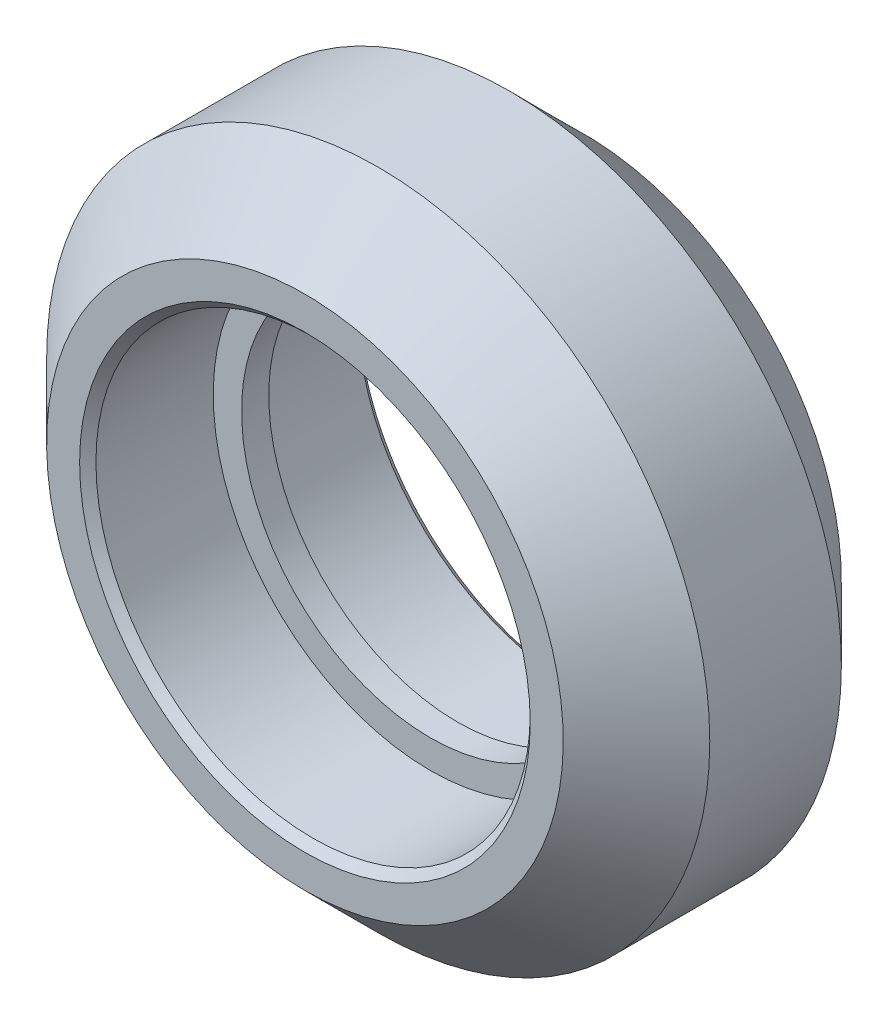
ISO-10303-21;
HEADER;
FILE_DESCRIPTION(('STEP AP214'),'2;1');
FILE_NAME('part.step','',(''),(''),'','','');
FILE_SCHEMA(('AUTOMOTIVE_DESIGN { 1 0 10303 214 1 1 1 1 }'));
ENDSEC;
DATA;
#1=APPLICATION_CONTEXT('core data for automotive mechanical design processes');
#2=APPLICATION_PROTOCOL_DEFINITION('international standard','automotive_design',2000,#1);
#3=PRODUCT_CONTEXT('',#1,'mechanical');
#4=PRODUCT('Part','Part','',(#3));
#5=PRODUCT_RELATED_PRODUCT_CATEGORY('part','',(#4));
#6=PRODUCT_DEFINITION_FORMATION('','',#4);
#7=PRODUCT_DEFINITION_CONTEXT('part definition',#1,'design');
#8=PRODUCT_DEFINITION('design','',#6,#7);
#9=PRODUCT_DEFINITION_SHAPE('','',#8);
#10=(LENGTH_UNIT() NAMED_UNIT(*) SI_UNIT(.MILLI.,.METRE.));
#11=(NAMED_UNIT(*) PLANE_ANGLE_UNIT() SI_UNIT($,.RADIAN.));
#12=(NAMED_UNIT(*) SI_UNIT($,.STERADIAN.) SOLID_ANGLE_UNIT());
#13=UNCERTAINTY_MEASURE_WITH_UNIT(LENGTH_MEASURE(1.E-05),#10,'distance_accuracy_value','');
#14=(GEOMETRIC_REPRESENTATION_CONTEXT(3) GLOBAL_UNCERTAINTY_ASSIGNED_CONTEXT((#13)) GLOBAL_UNIT_ASSIGNED_CONTEXT((#10,
#11,#12)) REPRESENTATION_CONTEXT('',''));
#15=CARTESIAN_POINT('',(0.,0.,0.));
#16=DIRECTION('',(0.,0.,1.));
#17=DIRECTION('',(1.,0.,0.));
#18=AXIS2_PLACEMENT_3D('',#15,#16,#17);
#19=CARTESIAN_POINT('',(0.,0.,5.115));
#20=DIRECTION('',(0.,0.,1.));
#21=DIRECTION('',(0.,-1.,0.));
#22=AXIS2_PLACEMENT_3D('',#19,#20,#21);
#23=CYLINDRICAL_SURFACE('',#22,7.987);
#24=CARTESIAN_POINT('',(0.,0.,4.815));
#25=DIRECTION('',(0.,0.,-1.));
#26=DIRECTION('',(0.,1.,0.));
#27=AXIS2_PLACEMENT_3D('',#24,#25,#26);
#28=CIRCLE('',#27,7.987);
#29=CARTESIAN_POINT('',(0.,7.987,4.815));
#30=VERTEX_POINT('',#29);
#31=EDGE_CURVE('E45',#30,#30,#28,.F.);
#32=ORIENTED_EDGE('',*,*,#31,.T.);
#33=EDGE_LOOP('',(#32));
#34=FACE_BOUND('',#33,.T.);
#35=CARTESIAN_POINT('',(0.,0.,0.499999999999998));
#36=DIRECTION('',(0.,0.,1.));
#37=DIRECTION('',(0.,-1.,0.));
#38=AXIS2_PLACEMENT_3D('',#35,#36,#37);
#39=CIRCLE('',#38,7.987);
#40=CARTESIAN_POINT('',(0.,-7.987,0.499999999999996));
#41=VERTEX_POINT('',#40);
#42=EDGE_CURVE('E71',#41,#41,#39,.T.);
#43=ORIENTED_EDGE('',*,*,#42,.F.);
#44=EDGE_LOOP('',(#43));
#45=FACE_BOUND('',#44,.T.);
#46=ADVANCED_FACE('F30',(#34,#45),#23,.F.);
#47=CARTESIAN_POINT('',(0.,9.5,5.115));
#48=DIRECTION('',(0.,0.,-1.));
#49=DIRECTION('',(0.,1.,0.));
#50=AXIS2_PLACEMENT_3D('',#47,#48,#49);
#51=PLANE('',#50);
#52=CARTESIAN_POINT('',(0.,0.,5.115));
#53=DIRECTION('',(0.,0.,-1.));
#54=DIRECTION('',(0.,1.,0.));
#55=AXIS2_PLACEMENT_3D('',#52,#53,#54);
#56=CIRCLE('',#55,8.287);
#57=CARTESIAN_POINT('',(0.,8.287,5.115));
#58=VERTEX_POINT('',#57);
#59=EDGE_CURVE('E41',#58,#58,#56,.T.);
#60=ORIENTED_EDGE('',*,*,#59,.T.);
#61=EDGE_LOOP('',(#60));
#62=FACE_BOUND('',#61,.T.);
#63=CARTESIAN_POINT('',(0.,0.,5.115));
#64=DIRECTION('',(0.,0.,1.));
#65=DIRECTION('',(0.,-1.,0.));
#66=AXIS2_PLACEMENT_3D('',#63,#64,#65);
#67=CIRCLE('',#66,9.5);
#68=CARTESIAN_POINT('',(0.,-9.5,5.11499999999999));
#69=VERTEX_POINT('',#68);
#70=EDGE_CURVE('E50',#69,#69,#67,.T.);
#71=ORIENTED_EDGE('',*,*,#70,.T.);
#72=EDGE_LOOP('',(#71));
#73=FACE_BOUND('',#72,.T.);
#74=ADVANCED_FACE('F78',(#62,#73),#51,.F.);
#75=CARTESIAN_POINT('',(0.,0.,2.42));
#76=DIRECTION('',(0.,0.,-1.));
#77=DIRECTION('',(0.,1.,0.));
#78=AXIS2_PLACEMENT_3D('',#75,#76,#77);
#79=CONICAL_SURFACE('',#78,12.195,0.78539816339745);
#80=ORIENTED_EDGE('',*,*,#70,.F.);
#81=EDGE_LOOP('',(#80));
#82=FACE_BOUND('',#81,.T.);
#83=CARTESIAN_POINT('',(0.,0.,2.42));
#84=DIRECTION('',(0.,0.,1.));
#85=DIRECTION('',(0.,-1.,0.));
#86=AXIS2_PLACEMENT_3D('',#83,#84,#85);
#87=CIRCLE('',#86,12.195);
#88=CARTESIAN_POINT('',(0.,-12.195,2.42));
#89=VERTEX_POINT('',#88);
#90=EDGE_CURVE('E53',#89,#89,#87,.T.);
#91=ORIENTED_EDGE('',*,*,#90,.T.);
#92=EDGE_LOOP('',(#91));
#93=FACE_BOUND('',#92,.T.);
#94=ADVANCED_FACE('F84',(#82,#93),#79,.T.);
#95=CARTESIAN_POINT('',(0.,0.,5.115));
#96=DIRECTION('',(0.,0.,1.));
#97=DIRECTION('',(0.,-1.,0.));
#98=AXIS2_PLACEMENT_3D('',#95,#96,#97);
#99=CYLINDRICAL_SURFACE('',#98,12.195);
#100=ORIENTED_EDGE('',*,*,#90,.F.);
#101=EDGE_LOOP('',(#100));
#102=FACE_BOUND('',#101,.T.);
#103=CARTESIAN_POINT('',(0.,0.,-2.42000000000001));
#104=DIRECTION('',(0.,0.,1.));
#105=DIRECTION('',(0.,-1.,0.));
#106=AXIS2_PLACEMENT_3D('',#103,#104,#105);
#107=CIRCLE('',#106,12.195);
#108=CARTESIAN_POINT('',(0.,-12.195,-2.42000000000001));
#109=VERTEX_POINT('',#108);
#110=EDGE_CURVE('E56',#109,#109,#107,.T.);
#111=ORIENTED_EDGE('',*,*,#110,.T.);
#112=EDGE_LOOP('',(#111));
#113=FACE_BOUND('',#112,.T.);
#114=ADVANCED_FACE('F107',(#102,#113),#99,.T.);
#115=CARTESIAN_POINT('',(0.,0.,-5.115));
#116=DIRECTION('',(0.,0.,1.));
#117=DIRECTION('',(0.,-1.,0.));
#118=AXIS2_PLACEMENT_3D('',#115,#116,#117);
#119=CONICAL_SURFACE('',#118,9.5,0.78539816339745);
#120=ORIENTED_EDGE('',*,*,#110,.F.);
#121=EDGE_LOOP('',(#120));
#122=FACE_BOUND('',#121,.T.);
#123=CARTESIAN_POINT('',(0.,0.,-5.115));
#124=DIRECTION('',(0.,0.,1.));
#125=DIRECTION('',(0.,-1.,0.));
#126=AXIS2_PLACEMENT_3D('',#123,#124,#125);
#127=CIRCLE('',#126,9.5);
#128=CARTESIAN_POINT('',(0.,-9.5,-5.115));
#129=VERTEX_POINT('',#128);
#130=EDGE_CURVE('E59',#129,#129,#127,.T.);
#131=ORIENTED_EDGE('',*,*,#130,.T.);
#132=EDGE_LOOP('',(#131));
#133=FACE_BOUND('',#132,.T.);
#134=ADVANCED_FACE('F112',(#122,#133),#119,.T.);
#135=CARTESIAN_POINT('',(0.,9.5,-5.115));
#136=DIRECTION('',(0.,0.,1.));
#137=DIRECTION('',(0.,-1.,0.));
#138=AXIS2_PLACEMENT_3D('',#135,#136,#137);
#139=PLANE('',#138);
#140=CARTESIAN_POINT('',(0.,0.,-5.115));
#141=DIRECTION('',(0.,0.,1.));
#142=DIRECTION('',(0.,-1.,0.));
#143=AXIS2_PLACEMENT_3D('',#140,#141,#142);
#144=CIRCLE('',#143,8.287);
#145=CARTESIAN_POINT('',(0.,-8.28699999999999,-5.115));
#146=VERTEX_POINT('',#145);
#147=EDGE_CURVE('E37',#146,#146,#144,.T.);
#148=ORIENTED_EDGE('',*,*,#147,.T.);
#149=EDGE_LOOP('',(#148));
#150=FACE_BOUND('',#149,.T.);
#151=ORIENTED_EDGE('',*,*,#130,.F.);
#152=EDGE_LOOP('',(#151));
#153=FACE_BOUND('',#152,.T.);
#154=ADVANCED_FACE('F118',(#150,#153),#139,.F.);
#155=CARTESIAN_POINT('',(0.,0.,5.115));
#156=DIRECTION('',(0.,0.,1.));
#157=DIRECTION('',(0.,-1.,0.));
#158=AXIS2_PLACEMENT_3D('',#155,#156,#157);
#159=CYLINDRICAL_SURFACE('',#158,7.987);
#160=CARTESIAN_POINT('',(0.,0.,-4.81500000000001));
#161=DIRECTION('',(0.,0.,1.));
#162=DIRECTION('',(0.,-1.,0.));
#163=AXIS2_PLACEMENT_3D('',#160,#161,#162);
#164=CIRCLE('',#163,7.987);
#165=CARTESIAN_POINT('',(0.,-7.987,-4.81500000000001));
#166=VERTEX_POINT('',#165);
#167=EDGE_CURVE('E10',#166,#166,#164,.F.);
#168=ORIENTED_EDGE('',*,*,#167,.T.);
#169=EDGE_LOOP('',(#168));
#170=FACE_BOUND('',#169,.T.);
#171=CARTESIAN_POINT('',(0.,0.,-0.500000000000001));
#172=DIRECTION('',(0.,0.,1.));
#173=DIRECTION('',(0.,-1.,0.));
#174=AXIS2_PLACEMENT_3D('',#171,#172,#173);
#175=CIRCLE('',#174,7.987);
#176=CARTESIAN_POINT('',(0.,-7.987,-0.500000000000003));
#177=VERTEX_POINT('',#176);
#178=EDGE_CURVE('E62',#177,#177,#175,.T.);
#179=ORIENTED_EDGE('',*,*,#178,.T.);
#180=EDGE_LOOP('',(#179));
#181=FACE_BOUND('',#180,.T.);
#182=ADVANCED_FACE('F123',(#170,#181),#159,.F.);
#183=CARTESIAN_POINT('',(0.,7.987,-0.5));
#184=DIRECTION('',(0.,0.,1.));
#185=DIRECTION('',(0.,-1.,0.));
#186=AXIS2_PLACEMENT_3D('',#183,#184,#185);
#187=PLANE('',#186);
#188=ORIENTED_EDGE('',*,*,#178,.F.);
#189=EDGE_LOOP('',(#188));
#190=FACE_BOUND('',#189,.T.);
#191=CARTESIAN_POINT('',(0.,0.,-0.500000000000002));
#192=DIRECTION('',(0.,0.,1.));
#193=DIRECTION('',(0.,-1.,0.));
#194=AXIS2_PLACEMENT_3D('',#191,#192,#193);
#195=CIRCLE('',#194,6.945);
#196=CARTESIAN_POINT('',(0.,-6.945,-0.500000000000003));
#197=VERTEX_POINT('',#196);
#198=EDGE_CURVE('E65',#197,#197,#195,.T.);
#199=ORIENTED_EDGE('',*,*,#198,.T.);
#200=EDGE_LOOP('',(#199));
#201=FACE_BOUND('',#200,.T.);
#202=ADVANCED_FACE('F128',(#190,#201),#187,.F.);
#203=CARTESIAN_POINT('',(0.,0.,5.115));
#204=DIRECTION('',(0.,0.,1.));
#205=DIRECTION('',(0.,-1.,0.));
#206=AXIS2_PLACEMENT_3D('',#203,#204,#205);
#207=CYLINDRICAL_SURFACE('',#206,6.945);
#208=ORIENTED_EDGE('',*,*,#198,.F.);
#209=EDGE_LOOP('',(#208));
#210=FACE_BOUND('',#209,.T.);
#211=CARTESIAN_POINT('',(0.,0.,0.499999999999999));
#212=DIRECTION('',(0.,0.,1.));
#213=DIRECTION('',(0.,-1.,0.));
#214=AXIS2_PLACEMENT_3D('',#211,#212,#213);
#215=CIRCLE('',#214,6.945);
#216=CARTESIAN_POINT('',(0.,-6.945,0.499999999999997));
#217=VERTEX_POINT('',#216);
#218=EDGE_CURVE('E68',#217,#217,#215,.T.);
#219=ORIENTED_EDGE('',*,*,#218,.T.);
#220=EDGE_LOOP('',(#219));
#221=FACE_BOUND('',#220,.T.);
#222=ADVANCED_FACE('F96',(#210,#221),#207,.F.);
#223=CARTESIAN_POINT('',(0.,7.987,0.5));
#224=DIRECTION('',(0.,0.,-1.));
#225=DIRECTION('',(0.,1.,0.));
#226=AXIS2_PLACEMENT_3D('',#223,#224,#225);
#227=PLANE('',#226);
#228=ORIENTED_EDGE('',*,*,#218,.F.);
#229=EDGE_LOOP('',(#228));
#230=FACE_BOUND('',#229,.T.);
#231=ORIENTED_EDGE('',*,*,#42,.T.);
#232=EDGE_LOOP('',(#231));
#233=FACE_BOUND('',#232,.T.);
#234=ADVANCED_FACE('F75',(#230,#233),#227,.F.);
#235=CARTESIAN_POINT('',(0.,0.,4.815));
#236=DIRECTION('',(0.,0.,1.));
#237=DIRECTION('',(0.,-1.,0.));
#238=AXIS2_PLACEMENT_3D('',#235,#236,#237);
#239=CONICAL_SURFACE('',#238,7.987,0.785398163397443);
#240=ORIENTED_EDGE('',*,*,#59,.F.);
#241=EDGE_LOOP('',(#240));
#242=FACE_BOUND('',#241,.T.);
#243=ORIENTED_EDGE('',*,*,#31,.F.);
#244=EDGE_LOOP('',(#243));
#245=FACE_BOUND('',#244,.T.);
#246=ADVANCED_FACE('F88',(#242,#245),#239,.F.);
#247=CARTESIAN_POINT('',(0.,0.,-5.115));
#248=DIRECTION('',(0.,0.,-1.));
#249=DIRECTION('',(0.,1.,0.));
#250=AXIS2_PLACEMENT_3D('',#247,#248,#249);
#251=CONICAL_SURFACE('',#250,8.287,0.785398163397454);
#252=ORIENTED_EDGE('',*,*,#167,.F.);
#253=EDGE_LOOP('',(#252));
#254=FACE_BOUND('',#253,.T.);
#255=ORIENTED_EDGE('',*,*,#147,.F.);
#256=EDGE_LOOP('',(#255));
#257=FACE_BOUND('',#256,.T.);
#258=ADVANCED_FACE('F32',(#254,#257),#251,.F.);
#259=CLOSED_SHELL('',(#46,#74,#94,#114,#134,#154,#182,#202,#222,#234,#246,#258));
#260=MANIFOLD_SOLID_BREP('B2',#259);
#261=ADVANCED_BREP_SHAPE_REPRESENTATION('',(#18,#260),#14);
#262=SHAPE_DEFINITION_REPRESENTATION(#9,#261);
ENDSEC;
END-ISO-10303-21;
